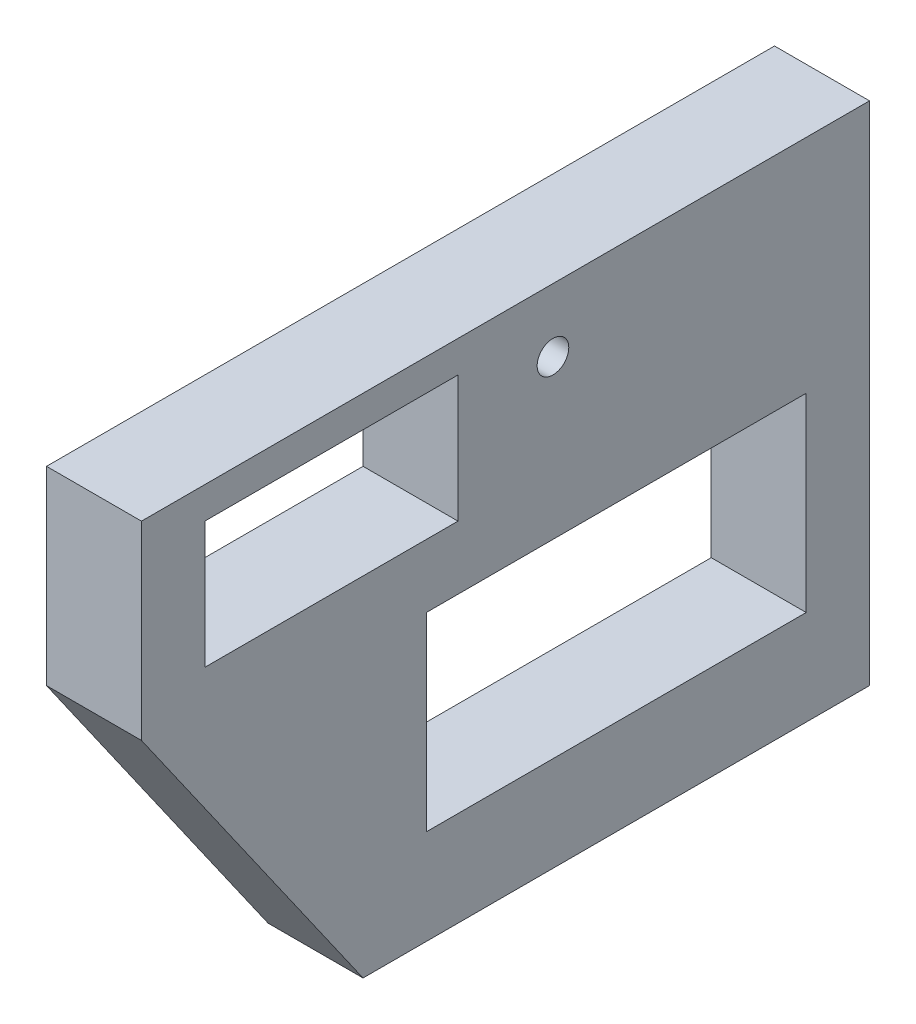
ISO-10303-21;
HEADER;
FILE_DESCRIPTION(('STEP AP214'),'2;1');
FILE_NAME('part.step','',(''),(''),'','','');
FILE_SCHEMA(('AUTOMOTIVE_DESIGN { 1 0 10303 214 1 1 1 1 }'));
ENDSEC;
DATA;
#1=APPLICATION_CONTEXT('core data for automotive mechanical design processes');
#2=APPLICATION_PROTOCOL_DEFINITION('international standard','automotive_design',2000,#1);
#3=PRODUCT_CONTEXT('',#1,'mechanical');
#4=PRODUCT('Part','Part','',(#3));
#5=PRODUCT_RELATED_PRODUCT_CATEGORY('part','',(#4));
#6=PRODUCT_DEFINITION_FORMATION('','',#4);
#7=PRODUCT_DEFINITION_CONTEXT('part definition',#1,'design');
#8=PRODUCT_DEFINITION('design','',#6,#7);
#9=PRODUCT_DEFINITION_SHAPE('','',#8);
#10=(LENGTH_UNIT() NAMED_UNIT(*) SI_UNIT(.MILLI.,.METRE.));
#11=(NAMED_UNIT(*) PLANE_ANGLE_UNIT() SI_UNIT($,.RADIAN.));
#12=(NAMED_UNIT(*) SI_UNIT($,.STERADIAN.) SOLID_ANGLE_UNIT());
#13=UNCERTAINTY_MEASURE_WITH_UNIT(LENGTH_MEASURE(1.E-05),#10,'distance_accuracy_value','');
#14=(GEOMETRIC_REPRESENTATION_CONTEXT(3) GLOBAL_UNCERTAINTY_ASSIGNED_CONTEXT((#13)) GLOBAL_UNIT_ASSIGNED_CONTEXT((#10,
#11,#12)) REPRESENTATION_CONTEXT('',''));
#15=CARTESIAN_POINT('',(0.,0.,0.));
#16=DIRECTION('',(0.,0.,1.));
#17=DIRECTION('',(1.,0.,0.));
#18=AXIS2_PLACEMENT_3D('',#15,#16,#17);
#19=CARTESIAN_POINT('',(15.,0.,0.));
#20=DIRECTION('',(-1.,0.,0.));
#21=DIRECTION('',(0.,0.,1.));
#22=AXIS2_PLACEMENT_3D('',#19,#20,#21);
#23=PLANE('',#22);
#24=CARTESIAN_POINT('',(15.,70.,50.));
#25=DIRECTION('',(1.,0.,0.));
#26=DIRECTION('',(0.,0.,-1.));
#27=AXIS2_PLACEMENT_3D('',#24,#25,#26);
#28=CIRCLE('',#27,2.5);
#29=CARTESIAN_POINT('',(15.,70.,47.5));
#30=VERTEX_POINT('',#29);
#31=EDGE_CURVE('E404',#30,#30,#28,.T.);
#32=ORIENTED_EDGE('',*,*,#31,.F.);
#33=EDGE_LOOP('',(#32));
#34=FACE_BOUND('',#33,.T.);
#35=DIRECTION('',(0.,-1.,0.));
#36=VECTOR('',#35,1.);
#37=CARTESIAN_POINT('',(15.,75.,105.));
#38=LINE('',#37,#36);
#39=CARTESIAN_POINT('',(15.,75.,105.));
#40=VERTEX_POINT('',#39);
#41=CARTESIAN_POINT('',(15.,55.,105.));
#42=VERTEX_POINT('',#41);
#43=EDGE_CURVE('E170',#40,#42,#38,.T.);
#44=ORIENTED_EDGE('',*,*,#43,.F.);
#45=DIRECTION('',(0.,0.,1.));
#46=VECTOR('',#45,1.);
#47=CARTESIAN_POINT('',(15.,75.,105.));
#48=LINE('',#47,#46);
#49=CARTESIAN_POINT('',(15.,75.,65.));
#50=VERTEX_POINT('',#49);
#51=EDGE_CURVE('E178',#50,#40,#48,.T.);
#52=ORIENTED_EDGE('',*,*,#51,.F.);
#53=DIRECTION('',(0.,1.,0.));
#54=VECTOR('',#53,1.);
#55=CARTESIAN_POINT('',(15.,75.,65.));
#56=LINE('',#55,#54);
#57=CARTESIAN_POINT('',(15.,55.,65.));
#58=VERTEX_POINT('',#57);
#59=EDGE_CURVE('E175',#58,#50,#56,.T.);
#60=ORIENTED_EDGE('',*,*,#59,.F.);
#61=DIRECTION('',(0.,0.,-1.));
#62=VECTOR('',#61,1.);
#63=CARTESIAN_POINT('',(15.,55.,105.));
#64=LINE('',#63,#62);
#65=EDGE_CURVE('E172',#42,#58,#64,.T.);
#66=ORIENTED_EDGE('',*,*,#65,.F.);
#67=EDGE_LOOP('',(#44,#52,#60,#66));
#68=FACE_BOUND('',#67,.T.);
#69=DIRECTION('',(0.,1.,0.));
#70=VECTOR('',#69,1.);
#71=CARTESIAN_POINT('',(15.,80.,0.));
#72=LINE('',#71,#70);
#73=CARTESIAN_POINT('',(15.,0.,0.));
#74=VERTEX_POINT('',#73);
#75=CARTESIAN_POINT('',(15.,80.,0.));
#76=VERTEX_POINT('',#75);
#77=EDGE_CURVE('E201',#74,#76,#72,.T.);
#78=ORIENTED_EDGE('',*,*,#77,.T.);
#79=DIRECTION('',(0.,0.,1.));
#80=VECTOR('',#79,1.);
#81=CARTESIAN_POINT('',(15.,80.,0.));
#82=LINE('',#81,#80);
#83=CARTESIAN_POINT('',(15.,80.,115.));
#84=VERTEX_POINT('',#83);
#85=EDGE_CURVE('E204',#76,#84,#82,.T.);
#86=ORIENTED_EDGE('',*,*,#85,.T.);
#87=DIRECTION('',(0.,-1.,0.));
#88=VECTOR('',#87,1.);
#89=CARTESIAN_POINT('',(15.,80.,115.));
#90=LINE('',#89,#88);
#91=CARTESIAN_POINT('',(15.,50.,115.));
#92=VERTEX_POINT('',#91);
#93=EDGE_CURVE('E207',#84,#92,#90,.T.);
#94=ORIENTED_EDGE('',*,*,#93,.T.);
#95=DIRECTION('',(0.,-0.81923192051904,-0.573462344363328));
#96=VECTOR('',#95,1.);
#97=CARTESIAN_POINT('',(15.,50.,115.));
#98=LINE('',#97,#96);
#99=CARTESIAN_POINT('',(15.,0.,80.));
#100=VERTEX_POINT('',#99);
#101=EDGE_CURVE('E209',#92,#100,#98,.T.);
#102=ORIENTED_EDGE('',*,*,#101,.T.);
#103=DIRECTION('',(0.,0.,-1.));
#104=VECTOR('',#103,1.);
#105=CARTESIAN_POINT('',(15.,0.,0.));
#106=LINE('',#105,#104);
#107=EDGE_CURVE('E211',#100,#74,#106,.T.);
#108=ORIENTED_EDGE('',*,*,#107,.T.);
#109=EDGE_LOOP('',(#78,#86,#94,#102,#108));
#110=FACE_BOUND('',#109,.T.);
#111=DIRECTION('',(0.,-1.,0.));
#112=VECTOR('',#111,1.);
#113=CARTESIAN_POINT('',(15.,45.,70.));
#114=LINE('',#113,#112);
#115=CARTESIAN_POINT('',(15.,45.,70.));
#116=VERTEX_POINT('',#115);
#117=CARTESIAN_POINT('',(15.,15.,70.));
#118=VERTEX_POINT('',#117);
#119=EDGE_CURVE('E132',#116,#118,#114,.T.);
#120=ORIENTED_EDGE('',*,*,#119,.F.);
#121=DIRECTION('',(0.,0.,1.));
#122=VECTOR('',#121,1.);
#123=CARTESIAN_POINT('',(15.,45.,70.));
#124=LINE('',#123,#122);
#125=CARTESIAN_POINT('',(15.,45.,9.99999999999998));
#126=VERTEX_POINT('',#125);
#127=EDGE_CURVE('E154',#126,#116,#124,.T.);
#128=ORIENTED_EDGE('',*,*,#127,.F.);
#129=DIRECTION('',(0.,1.,0.));
#130=VECTOR('',#129,1.);
#131=CARTESIAN_POINT('',(15.,45.,9.99999999999998));
#132=LINE('',#131,#130);
#133=CARTESIAN_POINT('',(15.,15.,9.99999999999997));
#134=VERTEX_POINT('',#133);
#135=EDGE_CURVE('E152',#134,#126,#132,.T.);
#136=ORIENTED_EDGE('',*,*,#135,.F.);
#137=DIRECTION('',(0.,0.,-1.));
#138=VECTOR('',#137,1.);
#139=CARTESIAN_POINT('',(15.,15.,70.));
#140=LINE('',#139,#138);
#141=EDGE_CURVE('E140',#118,#134,#140,.T.);
#142=ORIENTED_EDGE('',*,*,#141,.F.);
#143=EDGE_LOOP('',(#120,#128,#136,#142));
#144=FACE_BOUND('',#143,.T.);
#145=ADVANCED_FACE('F37',(#34,#68,#110,#144),#23,.F.);
#146=CARTESIAN_POINT('',(0.,0.,0.));
#147=DIRECTION('',(-1.,0.,0.));
#148=DIRECTION('',(0.,0.,1.));
#149=AXIS2_PLACEMENT_3D('',#146,#147,#148);
#150=PLANE('',#149);
#151=CARTESIAN_POINT('',(0.,70.,50.));
#152=DIRECTION('',(1.,0.,0.));
#153=DIRECTION('',(0.,0.,-1.));
#154=AXIS2_PLACEMENT_3D('',#151,#152,#153);
#155=CIRCLE('',#154,2.5);
#156=CARTESIAN_POINT('',(0.,70.,47.5));
#157=VERTEX_POINT('',#156);
#158=EDGE_CURVE('E160',#157,#157,#155,.T.);
#159=ORIENTED_EDGE('',*,*,#158,.T.);
#160=EDGE_LOOP('',(#159));
#161=FACE_BOUND('',#160,.T.);
#162=DIRECTION('',(0.,1.,0.));
#163=VECTOR('',#162,1.);
#164=CARTESIAN_POINT('',(0.,80.,0.));
#165=LINE('',#164,#163);
#166=CARTESIAN_POINT('',(0.,0.,0.));
#167=VERTEX_POINT('',#166);
#168=CARTESIAN_POINT('',(0.,80.,0.));
#169=VERTEX_POINT('',#168);
#170=EDGE_CURVE('E200',#167,#169,#165,.T.);
#171=ORIENTED_EDGE('',*,*,#170,.F.);
#172=DIRECTION('',(0.,0.,-1.));
#173=VECTOR('',#172,1.);
#174=CARTESIAN_POINT('',(0.,0.,0.));
#175=LINE('',#174,#173);
#176=CARTESIAN_POINT('',(0.,0.,80.));
#177=VERTEX_POINT('',#176);
#178=EDGE_CURVE('E205',#177,#167,#175,.T.);
#179=ORIENTED_EDGE('',*,*,#178,.F.);
#180=DIRECTION('',(0.,-0.81923192051904,-0.573462344363328));
#181=VECTOR('',#180,1.);
#182=CARTESIAN_POINT('',(0.,50.,115.));
#183=LINE('',#182,#181);
#184=CARTESIAN_POINT('',(0.,50.,115.));
#185=VERTEX_POINT('',#184);
#186=EDGE_CURVE('E220',#185,#177,#183,.T.);
#187=ORIENTED_EDGE('',*,*,#186,.F.);
#188=DIRECTION('',(0.,-1.,0.));
#189=VECTOR('',#188,1.);
#190=CARTESIAN_POINT('',(0.,80.,115.));
#191=LINE('',#190,#189);
#192=CARTESIAN_POINT('',(0.,80.,115.));
#193=VERTEX_POINT('',#192);
#194=EDGE_CURVE('E218',#193,#185,#191,.T.);
#195=ORIENTED_EDGE('',*,*,#194,.F.);
#196=DIRECTION('',(0.,0.,1.));
#197=VECTOR('',#196,1.);
#198=CARTESIAN_POINT('',(0.,80.,0.));
#199=LINE('',#198,#197);
#200=EDGE_CURVE('E216',#169,#193,#199,.T.);
#201=ORIENTED_EDGE('',*,*,#200,.F.);
#202=EDGE_LOOP('',(#171,#179,#187,#195,#201));
#203=FACE_BOUND('',#202,.T.);
#204=DIRECTION('',(0.,0.,1.));
#205=VECTOR('',#204,1.);
#206=CARTESIAN_POINT('',(0.,75.,105.));
#207=LINE('',#206,#205);
#208=CARTESIAN_POINT('',(0.,75.,65.));
#209=VERTEX_POINT('',#208);
#210=CARTESIAN_POINT('',(0.,75.,105.));
#211=VERTEX_POINT('',#210);
#212=EDGE_CURVE('E173',#209,#211,#207,.T.);
#213=ORIENTED_EDGE('',*,*,#212,.T.);
#214=DIRECTION('',(0.,-1.,0.));
#215=VECTOR('',#214,1.);
#216=CARTESIAN_POINT('',(0.,75.,105.));
#217=LINE('',#216,#215);
#218=CARTESIAN_POINT('',(0.,55.,105.));
#219=VERTEX_POINT('',#218);
#220=EDGE_CURVE('E148',#211,#219,#217,.T.);
#221=ORIENTED_EDGE('',*,*,#220,.T.);
#222=DIRECTION('',(0.,0.,-1.));
#223=VECTOR('',#222,1.);
#224=CARTESIAN_POINT('',(0.,55.,105.));
#225=LINE('',#224,#223);
#226=CARTESIAN_POINT('',(0.,55.,65.));
#227=VERTEX_POINT('',#226);
#228=EDGE_CURVE('E183',#219,#227,#225,.T.);
#229=ORIENTED_EDGE('',*,*,#228,.T.);
#230=DIRECTION('',(0.,1.,0.));
#231=VECTOR('',#230,1.);
#232=CARTESIAN_POINT('',(0.,75.,65.));
#233=LINE('',#232,#231);
#234=EDGE_CURVE('E186',#227,#209,#233,.T.);
#235=ORIENTED_EDGE('',*,*,#234,.T.);
#236=EDGE_LOOP('',(#213,#221,#229,#235));
#237=FACE_BOUND('',#236,.T.);
#238=DIRECTION('',(0.,0.,1.));
#239=VECTOR('',#238,1.);
#240=CARTESIAN_POINT('',(0.,45.,70.));
#241=LINE('',#240,#239);
#242=CARTESIAN_POINT('',(0.,45.,9.99999999999998));
#243=VERTEX_POINT('',#242);
#244=CARTESIAN_POINT('',(0.,45.,70.));
#245=VERTEX_POINT('',#244);
#246=EDGE_CURVE('E141',#243,#245,#241,.T.);
#247=ORIENTED_EDGE('',*,*,#246,.T.);
#248=DIRECTION('',(0.,-1.,0.));
#249=VECTOR('',#248,1.);
#250=CARTESIAN_POINT('',(0.,45.,70.));
#251=LINE('',#250,#249);
#252=CARTESIAN_POINT('',(0.,15.,70.));
#253=VERTEX_POINT('',#252);
#254=EDGE_CURVE('E60',#245,#253,#251,.T.);
#255=ORIENTED_EDGE('',*,*,#254,.T.);
#256=DIRECTION('',(0.,0.,-1.));
#257=VECTOR('',#256,1.);
#258=CARTESIAN_POINT('',(0.,15.,70.));
#259=LINE('',#258,#257);
#260=CARTESIAN_POINT('',(0.,15.,9.99999999999997));
#261=VERTEX_POINT('',#260);
#262=EDGE_CURVE('E147',#253,#261,#259,.T.);
#263=ORIENTED_EDGE('',*,*,#262,.T.);
#264=DIRECTION('',(0.,1.,0.));
#265=VECTOR('',#264,1.);
#266=CARTESIAN_POINT('',(0.,45.,9.99999999999998));
#267=LINE('',#266,#265);
#268=EDGE_CURVE('E162',#261,#243,#267,.T.);
#269=ORIENTED_EDGE('',*,*,#268,.T.);
#270=EDGE_LOOP('',(#247,#255,#263,#269));
#271=FACE_BOUND('',#270,.T.);
#272=ADVANCED_FACE('F241',(#161,#203,#237,#271),#150,.T.);
#273=CARTESIAN_POINT('',(15.,80.,0.));
#274=DIRECTION('',(0.,0.,1.));
#275=DIRECTION('',(1.,0.,0.));
#276=AXIS2_PLACEMENT_3D('',#273,#274,#275);
#277=PLANE('',#276);
#278=ORIENTED_EDGE('',*,*,#170,.T.);
#279=DIRECTION('',(-1.,0.,0.));
#280=VECTOR('',#279,1.);
#281=CARTESIAN_POINT('',(15.,80.,0.));
#282=LINE('',#281,#280);
#283=EDGE_CURVE('E11',#76,#169,#282,.T.);
#284=ORIENTED_EDGE('',*,*,#283,.F.);
#285=ORIENTED_EDGE('',*,*,#77,.F.);
#286=DIRECTION('',(-1.,0.,0.));
#287=VECTOR('',#286,1.);
#288=CARTESIAN_POINT('',(15.,0.,0.));
#289=LINE('',#288,#287);
#290=EDGE_CURVE('E213',#74,#167,#289,.T.);
#291=ORIENTED_EDGE('',*,*,#290,.T.);
#292=EDGE_LOOP('',(#278,#284,#285,#291));
#293=FACE_BOUND('',#292,.T.);
#294=ADVANCED_FACE('F39',(#293),#277,.F.);
#295=CARTESIAN_POINT('',(15.,80.,0.));
#296=DIRECTION('',(0.,-1.,0.));
#297=DIRECTION('',(0.,0.,-1.));
#298=AXIS2_PLACEMENT_3D('',#295,#296,#297);
#299=PLANE('',#298);
#300=ORIENTED_EDGE('',*,*,#200,.T.);
#301=DIRECTION('',(-1.,0.,0.));
#302=VECTOR('',#301,1.);
#303=CARTESIAN_POINT('',(15.,80.,115.));
#304=LINE('',#303,#302);
#305=EDGE_CURVE('E45',#84,#193,#304,.T.);
#306=ORIENTED_EDGE('',*,*,#305,.F.);
#307=ORIENTED_EDGE('',*,*,#85,.F.);
#308=ORIENTED_EDGE('',*,*,#283,.T.);
#309=EDGE_LOOP('',(#300,#306,#307,#308));
#310=FACE_BOUND('',#309,.T.);
#311=ADVANCED_FACE('F255',(#310),#299,.F.);
#312=CARTESIAN_POINT('',(15.,80.,115.));
#313=DIRECTION('',(0.,0.,-1.));
#314=DIRECTION('',(-1.,0.,0.));
#315=AXIS2_PLACEMENT_3D('',#312,#313,#314);
#316=PLANE('',#315);
#317=ORIENTED_EDGE('',*,*,#194,.T.);
#318=DIRECTION('',(-1.,0.,0.));
#319=VECTOR('',#318,1.);
#320=CARTESIAN_POINT('',(15.,50.,115.));
#321=LINE('',#320,#319);
#322=EDGE_CURVE('E228',#92,#185,#321,.T.);
#323=ORIENTED_EDGE('',*,*,#322,.F.);
#324=ORIENTED_EDGE('',*,*,#93,.F.);
#325=ORIENTED_EDGE('',*,*,#305,.T.);
#326=EDGE_LOOP('',(#317,#323,#324,#325));
#327=FACE_BOUND('',#326,.T.);
#328=ADVANCED_FACE('F235',(#327),#316,.F.);
#329=CARTESIAN_POINT('',(15.,50.,115.));
#330=DIRECTION('',(0.,0.573462344363328,-0.81923192051904));
#331=DIRECTION('',(0.,0.81923192051904,0.573462344363328));
#332=AXIS2_PLACEMENT_3D('',#329,#330,#331);
#333=PLANE('',#332);
#334=ORIENTED_EDGE('',*,*,#186,.T.);
#335=DIRECTION('',(-1.,0.,0.));
#336=VECTOR('',#335,1.);
#337=CARTESIAN_POINT('',(15.,0.,80.));
#338=LINE('',#337,#336);
#339=EDGE_CURVE('E225',#100,#177,#338,.T.);
#340=ORIENTED_EDGE('',*,*,#339,.F.);
#341=ORIENTED_EDGE('',*,*,#101,.F.);
#342=ORIENTED_EDGE('',*,*,#322,.T.);
#343=EDGE_LOOP('',(#334,#340,#341,#342));
#344=FACE_BOUND('',#343,.T.);
#345=ADVANCED_FACE('F246',(#344),#333,.F.);
#346=CARTESIAN_POINT('',(15.,0.,0.));
#347=DIRECTION('',(0.,1.,0.));
#348=DIRECTION('',(0.,0.,1.));
#349=AXIS2_PLACEMENT_3D('',#346,#347,#348);
#350=PLANE('',#349);
#351=ORIENTED_EDGE('',*,*,#178,.T.);
#352=ORIENTED_EDGE('',*,*,#290,.F.);
#353=ORIENTED_EDGE('',*,*,#107,.F.);
#354=ORIENTED_EDGE('',*,*,#339,.T.);
#355=EDGE_LOOP('',(#351,#352,#353,#354));
#356=FACE_BOUND('',#355,.T.);
#357=ADVANCED_FACE('F250',(#356),#350,.F.);
#358=CARTESIAN_POINT('',(15.,75.,105.));
#359=DIRECTION('',(0.,0.,-1.));
#360=DIRECTION('',(0.,1.,0.));
#361=AXIS2_PLACEMENT_3D('',#358,#359,#360);
#362=PLANE('',#361);
#363=ORIENTED_EDGE('',*,*,#220,.F.);
#364=DIRECTION('',(-1.,0.,0.));
#365=VECTOR('',#364,1.);
#366=CARTESIAN_POINT('',(15.,75.,105.));
#367=LINE('',#366,#365);
#368=EDGE_CURVE('E180',#40,#211,#367,.T.);
#369=ORIENTED_EDGE('',*,*,#368,.F.);
#370=ORIENTED_EDGE('',*,*,#43,.T.);
#371=DIRECTION('',(-1.,0.,0.));
#372=VECTOR('',#371,1.);
#373=CARTESIAN_POINT('',(15.,55.,105.));
#374=LINE('',#373,#372);
#375=EDGE_CURVE('E197',#42,#219,#374,.T.);
#376=ORIENTED_EDGE('',*,*,#375,.T.);
#377=EDGE_LOOP('',(#363,#369,#370,#376));
#378=FACE_BOUND('',#377,.T.);
#379=ADVANCED_FACE('F274',(#378),#362,.T.);
#380=CARTESIAN_POINT('',(15.,55.,105.));
#381=DIRECTION('',(0.,1.,0.));
#382=DIRECTION('',(0.,0.,1.));
#383=AXIS2_PLACEMENT_3D('',#380,#381,#382);
#384=PLANE('',#383);
#385=ORIENTED_EDGE('',*,*,#228,.F.);
#386=ORIENTED_EDGE('',*,*,#375,.F.);
#387=ORIENTED_EDGE('',*,*,#65,.T.);
#388=DIRECTION('',(-1.,0.,0.));
#389=VECTOR('',#388,1.);
#390=CARTESIAN_POINT('',(15.,55.,65.));
#391=LINE('',#390,#389);
#392=EDGE_CURVE('E195',#58,#227,#391,.T.);
#393=ORIENTED_EDGE('',*,*,#392,.T.);
#394=EDGE_LOOP('',(#385,#386,#387,#393));
#395=FACE_BOUND('',#394,.T.);
#396=ADVANCED_FACE('F300',(#395),#384,.T.);
#397=CARTESIAN_POINT('',(15.,75.,65.));
#398=DIRECTION('',(0.,0.,1.));
#399=DIRECTION('',(1.,0.,0.));
#400=AXIS2_PLACEMENT_3D('',#397,#398,#399);
#401=PLANE('',#400);
#402=ORIENTED_EDGE('',*,*,#234,.F.);
#403=ORIENTED_EDGE('',*,*,#392,.F.);
#404=ORIENTED_EDGE('',*,*,#59,.T.);
#405=DIRECTION('',(-1.,0.,0.));
#406=VECTOR('',#405,1.);
#407=CARTESIAN_POINT('',(15.,75.,65.));
#408=LINE('',#407,#406);
#409=EDGE_CURVE('E193',#50,#209,#408,.T.);
#410=ORIENTED_EDGE('',*,*,#409,.T.);
#411=EDGE_LOOP('',(#402,#403,#404,#410));
#412=FACE_BOUND('',#411,.T.);
#413=ADVANCED_FACE('F307',(#412),#401,.T.);
#414=CARTESIAN_POINT('',(15.,75.,105.));
#415=DIRECTION('',(0.,-1.,0.));
#416=DIRECTION('',(0.,0.,-1.));
#417=AXIS2_PLACEMENT_3D('',#414,#415,#416);
#418=PLANE('',#417);
#419=ORIENTED_EDGE('',*,*,#212,.F.);
#420=ORIENTED_EDGE('',*,*,#409,.F.);
#421=ORIENTED_EDGE('',*,*,#51,.T.);
#422=ORIENTED_EDGE('',*,*,#368,.T.);
#423=EDGE_LOOP('',(#419,#420,#421,#422));
#424=FACE_BOUND('',#423,.T.);
#425=ADVANCED_FACE('F314',(#424),#418,.T.);
#426=CARTESIAN_POINT('',(15.,45.,70.));
#427=DIRECTION('',(0.,0.,-1.));
#428=DIRECTION('',(-1.,0.,0.));
#429=AXIS2_PLACEMENT_3D('',#426,#427,#428);
#430=PLANE('',#429);
#431=ORIENTED_EDGE('',*,*,#254,.F.);
#432=DIRECTION('',(-1.,0.,0.));
#433=VECTOR('',#432,1.);
#434=CARTESIAN_POINT('',(15.,45.,70.));
#435=LINE('',#434,#433);
#436=EDGE_CURVE('E136',#116,#245,#435,.T.);
#437=ORIENTED_EDGE('',*,*,#436,.F.);
#438=ORIENTED_EDGE('',*,*,#119,.T.);
#439=DIRECTION('',(-1.,0.,0.));
#440=VECTOR('',#439,1.);
#441=CARTESIAN_POINT('',(15.,15.,70.));
#442=LINE('',#441,#440);
#443=EDGE_CURVE('E135',#118,#253,#442,.T.);
#444=ORIENTED_EDGE('',*,*,#443,.T.);
#445=EDGE_LOOP('',(#431,#437,#438,#444));
#446=FACE_BOUND('',#445,.T.);
#447=ADVANCED_FACE('F134',(#446),#430,.T.);
#448=CARTESIAN_POINT('',(15.,15.,70.));
#449=DIRECTION('',(0.,1.,0.));
#450=DIRECTION('',(0.,0.,1.));
#451=AXIS2_PLACEMENT_3D('',#448,#449,#450);
#452=PLANE('',#451);
#453=ORIENTED_EDGE('',*,*,#262,.F.);
#454=ORIENTED_EDGE('',*,*,#443,.F.);
#455=ORIENTED_EDGE('',*,*,#141,.T.);
#456=DIRECTION('',(-1.,0.,0.));
#457=VECTOR('',#456,1.);
#458=CARTESIAN_POINT('',(15.,15.,9.99999999999997));
#459=LINE('',#458,#457);
#460=EDGE_CURVE('E149',#134,#261,#459,.T.);
#461=ORIENTED_EDGE('',*,*,#460,.T.);
#462=EDGE_LOOP('',(#453,#454,#455,#461));
#463=FACE_BOUND('',#462,.T.);
#464=ADVANCED_FACE('F144',(#463),#452,.T.);
#465=CARTESIAN_POINT('',(15.,45.,9.99999999999998));
#466=DIRECTION('',(0.,0.,1.));
#467=DIRECTION('',(0.,-1.,0.));
#468=AXIS2_PLACEMENT_3D('',#465,#466,#467);
#469=PLANE('',#468);
#470=ORIENTED_EDGE('',*,*,#268,.F.);
#471=ORIENTED_EDGE('',*,*,#460,.F.);
#472=ORIENTED_EDGE('',*,*,#135,.T.);
#473=DIRECTION('',(-1.,0.,0.));
#474=VECTOR('',#473,1.);
#475=CARTESIAN_POINT('',(15.,45.,9.99999999999998));
#476=LINE('',#475,#474);
#477=EDGE_CURVE('E52',#126,#243,#476,.T.);
#478=ORIENTED_EDGE('',*,*,#477,.T.);
#479=EDGE_LOOP('',(#470,#471,#472,#478));
#480=FACE_BOUND('',#479,.T.);
#481=ADVANCED_FACE('F335',(#480),#469,.T.);
#482=CARTESIAN_POINT('',(15.,45.,70.));
#483=DIRECTION('',(0.,-1.,0.));
#484=DIRECTION('',(0.,0.,-1.));
#485=AXIS2_PLACEMENT_3D('',#482,#483,#484);
#486=PLANE('',#485);
#487=ORIENTED_EDGE('',*,*,#246,.F.);
#488=ORIENTED_EDGE('',*,*,#477,.F.);
#489=ORIENTED_EDGE('',*,*,#127,.T.);
#490=ORIENTED_EDGE('',*,*,#436,.T.);
#491=EDGE_LOOP('',(#487,#488,#489,#490));
#492=FACE_BOUND('',#491,.T.);
#493=ADVANCED_FACE('F342',(#492),#486,.T.);
#494=CARTESIAN_POINT('',(0.,70.,50.));
#495=DIRECTION('',(1.,0.,0.));
#496=DIRECTION('',(0.,0.,-1.));
#497=AXIS2_PLACEMENT_3D('',#494,#495,#496);
#498=CYLINDRICAL_SURFACE('',#497,2.5);
#499=ORIENTED_EDGE('',*,*,#158,.F.);
#500=EDGE_LOOP('',(#499));
#501=FACE_BOUND('',#500,.T.);
#502=ORIENTED_EDGE('',*,*,#31,.T.);
#503=EDGE_LOOP('',(#502));
#504=FACE_BOUND('',#503,.T.);
#505=ADVANCED_FACE('F349',(#501,#504),#498,.F.);
#506=CLOSED_SHELL('',(#145,#272,#294,#311,#328,#345,#357,#379,#396,#413,#425,#447,#464,#481,
#493,#505));
#507=MANIFOLD_SOLID_BREP('B2',#506);
#508=ADVANCED_BREP_SHAPE_REPRESENTATION('',(#18,#507),#14);
#509=SHAPE_DEFINITION_REPRESENTATION(#9,#508);
ENDSEC;
END-ISO-10303-21;
